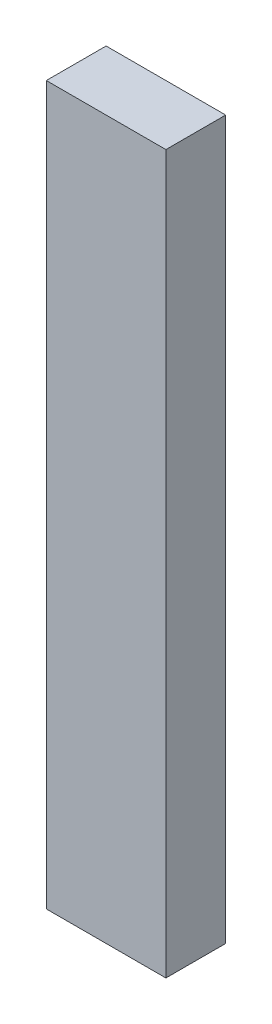
ISO-10303-21;
HEADER;
FILE_DESCRIPTION(('STEP AP214'),'2;1');
FILE_NAME('part.step','',(''),(''),'','','');
FILE_SCHEMA(('AUTOMOTIVE_DESIGN { 1 0 10303 214 1 1 1 1 }'));
ENDSEC;
DATA;
#1=APPLICATION_CONTEXT('core data for automotive mechanical design processes');
#2=APPLICATION_PROTOCOL_DEFINITION('international standard','automotive_design',2000,#1);
#3=PRODUCT_CONTEXT('',#1,'mechanical');
#4=PRODUCT('Part','Part','',(#3));
#5=PRODUCT_RELATED_PRODUCT_CATEGORY('part','',(#4));
#6=PRODUCT_DEFINITION_FORMATION('','',#4);
#7=PRODUCT_DEFINITION_CONTEXT('part definition',#1,'design');
#8=PRODUCT_DEFINITION('design','',#6,#7);
#9=PRODUCT_DEFINITION_SHAPE('','',#8);
#10=(LENGTH_UNIT() NAMED_UNIT(*) SI_UNIT(.MILLI.,.METRE.));
#11=(NAMED_UNIT(*) PLANE_ANGLE_UNIT() SI_UNIT($,.RADIAN.));
#12=(NAMED_UNIT(*) SI_UNIT($,.STERADIAN.) SOLID_ANGLE_UNIT());
#13=UNCERTAINTY_MEASURE_WITH_UNIT(LENGTH_MEASURE(1.E-05),#10,'distance_accuracy_value','');
#14=(GEOMETRIC_REPRESENTATION_CONTEXT(3) GLOBAL_UNCERTAINTY_ASSIGNED_CONTEXT((#13)) GLOBAL_UNIT_ASSIGNED_CONTEXT((#10,
#11,#12)) REPRESENTATION_CONTEXT('',''));
#15=CARTESIAN_POINT('',(0.,0.,0.));
#16=DIRECTION('',(0.,0.,1.));
#17=DIRECTION('',(1.,0.,0.));
#18=AXIS2_PLACEMENT_3D('',#15,#16,#17);
#19=CARTESIAN_POINT('',(0.,609.6,0.));
#20=DIRECTION('',(1.,0.,0.));
#21=DIRECTION('',(0.,0.,-1.));
#22=AXIS2_PLACEMENT_3D('',#19,#20,#21);
#23=PLANE('',#22);
#24=DIRECTION('',(0.,0.,1.));
#25=VECTOR('',#24,1.);
#26=CARTESIAN_POINT('',(0.,0.,0.));
#27=LINE('',#26,#25);
#28=CARTESIAN_POINT('',(0.,0.,0.));
#29=VERTEX_POINT('',#28);
#30=CARTESIAN_POINT('',(0.,0.,50.8));
#31=VERTEX_POINT('',#30);
#32=EDGE_CURVE('E107',#29,#31,#27,.T.);
#33=ORIENTED_EDGE('',*,*,#32,.T.);
#34=DIRECTION('',(0.,-1.,0.));
#35=VECTOR('',#34,1.);
#36=CARTESIAN_POINT('',(0.,609.6,50.8));
#37=LINE('',#36,#35);
#38=CARTESIAN_POINT('',(0.,609.6,50.8));
#39=VERTEX_POINT('',#38);
#40=EDGE_CURVE('E11',#39,#31,#37,.T.);
#41=ORIENTED_EDGE('',*,*,#40,.F.);
#42=DIRECTION('',(0.,0.,1.));
#43=VECTOR('',#42,1.);
#44=CARTESIAN_POINT('',(0.,609.6,0.));
#45=LINE('',#44,#43);
#46=CARTESIAN_POINT('',(0.,609.6,0.));
#47=VERTEX_POINT('',#46);
#48=EDGE_CURVE('E91',#47,#39,#45,.T.);
#49=ORIENTED_EDGE('',*,*,#48,.F.);
#50=DIRECTION('',(0.,-1.,0.));
#51=VECTOR('',#50,1.);
#52=CARTESIAN_POINT('',(0.,609.6,0.));
#53=LINE('',#52,#51);
#54=EDGE_CURVE('E103',#47,#29,#53,.T.);
#55=ORIENTED_EDGE('',*,*,#54,.T.);
#56=EDGE_LOOP('',(#33,#41,#49,#55));
#57=FACE_BOUND('',#56,.T.);
#58=ADVANCED_FACE('F39',(#57),#23,.F.);
#59=CARTESIAN_POINT('',(0.,609.6,50.8));
#60=DIRECTION('',(0.,0.,-1.));
#61=DIRECTION('',(-1.,0.,0.));
#62=AXIS2_PLACEMENT_3D('',#59,#60,#61);
#63=PLANE('',#62);
#64=DIRECTION('',(1.,0.,0.));
#65=VECTOR('',#64,1.);
#66=CARTESIAN_POINT('',(0.,0.,50.8));
#67=LINE('',#66,#65);
#68=CARTESIAN_POINT('',(101.6,0.,50.8));
#69=VERTEX_POINT('',#68);
#70=EDGE_CURVE('E96',#31,#69,#67,.T.);
#71=ORIENTED_EDGE('',*,*,#70,.T.);
#72=DIRECTION('',(0.,-1.,0.));
#73=VECTOR('',#72,1.);
#74=CARTESIAN_POINT('',(101.6,609.6,50.8));
#75=LINE('',#74,#73);
#76=CARTESIAN_POINT('',(101.6,609.6,50.8));
#77=VERTEX_POINT('',#76);
#78=EDGE_CURVE('E48',#77,#69,#75,.T.);
#79=ORIENTED_EDGE('',*,*,#78,.F.);
#80=DIRECTION('',(1.,0.,0.));
#81=VECTOR('',#80,1.);
#82=CARTESIAN_POINT('',(0.,609.6,50.8));
#83=LINE('',#82,#81);
#84=EDGE_CURVE('E86',#39,#77,#83,.T.);
#85=ORIENTED_EDGE('',*,*,#84,.F.);
#86=ORIENTED_EDGE('',*,*,#40,.T.);
#87=EDGE_LOOP('',(#71,#79,#85,#86));
#88=FACE_BOUND('',#87,.T.);
#89=ADVANCED_FACE('F95',(#88),#63,.F.);
#90=CARTESIAN_POINT('',(101.6,609.6,0.));
#91=DIRECTION('',(-1.,0.,0.));
#92=DIRECTION('',(0.,0.,1.));
#93=AXIS2_PLACEMENT_3D('',#90,#91,#92);
#94=PLANE('',#93);
#95=DIRECTION('',(0.,0.,-1.));
#96=VECTOR('',#95,1.);
#97=CARTESIAN_POINT('',(101.6,0.,0.));
#98=LINE('',#97,#96);
#99=CARTESIAN_POINT('',(101.6,0.,0.));
#100=VERTEX_POINT('',#99);
#101=EDGE_CURVE('E73',#69,#100,#98,.T.);
#102=ORIENTED_EDGE('',*,*,#101,.T.);
#103=DIRECTION('',(0.,-1.,0.));
#104=VECTOR('',#103,1.);
#105=CARTESIAN_POINT('',(101.6,609.6,0.));
#106=LINE('',#105,#104);
#107=CARTESIAN_POINT('',(101.6,609.6,0.));
#108=VERTEX_POINT('',#107);
#109=EDGE_CURVE('E98',#108,#100,#106,.T.);
#110=ORIENTED_EDGE('',*,*,#109,.F.);
#111=DIRECTION('',(0.,0.,-1.));
#112=VECTOR('',#111,1.);
#113=CARTESIAN_POINT('',(101.6,609.6,0.));
#114=LINE('',#113,#112);
#115=EDGE_CURVE('E89',#77,#108,#114,.T.);
#116=ORIENTED_EDGE('',*,*,#115,.F.);
#117=ORIENTED_EDGE('',*,*,#78,.T.);
#118=EDGE_LOOP('',(#102,#110,#116,#117));
#119=FACE_BOUND('',#118,.T.);
#120=ADVANCED_FACE('F99',(#119),#94,.F.);
#121=CARTESIAN_POINT('',(0.,609.6,0.));
#122=DIRECTION('',(0.,0.,1.));
#123=DIRECTION('',(1.,0.,0.));
#124=AXIS2_PLACEMENT_3D('',#121,#122,#123);
#125=PLANE('',#124);
#126=DIRECTION('',(-1.,0.,0.));
#127=VECTOR('',#126,1.);
#128=CARTESIAN_POINT('',(0.,0.,0.));
#129=LINE('',#128,#127);
#130=EDGE_CURVE('E79',#100,#29,#129,.T.);
#131=ORIENTED_EDGE('',*,*,#130,.T.);
#132=ORIENTED_EDGE('',*,*,#54,.F.);
#133=DIRECTION('',(-1.,0.,0.));
#134=VECTOR('',#133,1.);
#135=CARTESIAN_POINT('',(0.,609.6,0.));
#136=LINE('',#135,#134);
#137=EDGE_CURVE('E56',#108,#47,#136,.T.);
#138=ORIENTED_EDGE('',*,*,#137,.F.);
#139=ORIENTED_EDGE('',*,*,#109,.T.);
#140=EDGE_LOOP('',(#131,#132,#138,#139));
#141=FACE_BOUND('',#140,.T.);
#142=ADVANCED_FACE('F120',(#141),#125,.F.);
#143=CARTESIAN_POINT('',(0.,609.6,0.));
#144=DIRECTION('',(0.,1.,0.));
#145=DIRECTION('',(0.,0.,1.));
#146=AXIS2_PLACEMENT_3D('',#143,#144,#145);
#147=PLANE('',#146);
#148=ORIENTED_EDGE('',*,*,#48,.T.);
#149=ORIENTED_EDGE('',*,*,#84,.T.);
#150=ORIENTED_EDGE('',*,*,#115,.T.);
#151=ORIENTED_EDGE('',*,*,#137,.T.);
#152=EDGE_LOOP('',(#148,#149,#150,#151));
#153=FACE_BOUND('',#152,.T.);
#154=ADVANCED_FACE('F87',(#153),#147,.T.);
#155=CARTESIAN_POINT('',(0.,0.,0.));
#156=DIRECTION('',(0.,1.,0.));
#157=DIRECTION('',(0.,0.,1.));
#158=AXIS2_PLACEMENT_3D('',#155,#156,#157);
#159=PLANE('',#158);
#160=ORIENTED_EDGE('',*,*,#32,.F.);
#161=ORIENTED_EDGE('',*,*,#130,.F.);
#162=ORIENTED_EDGE('',*,*,#101,.F.);
#163=ORIENTED_EDGE('',*,*,#70,.F.);
#164=EDGE_LOOP('',(#160,#161,#162,#163));
#165=FACE_BOUND('',#164,.T.);
#166=ADVANCED_FACE('F123',(#165),#159,.F.);
#167=CLOSED_SHELL('',(#58,#89,#120,#142,#154,#166));
#168=MANIFOLD_SOLID_BREP('B2',#167);
#169=ADVANCED_BREP_SHAPE_REPRESENTATION('',(#18,#168),#14);
#170=SHAPE_DEFINITION_REPRESENTATION(#9,#169);
ENDSEC;
END-ISO-10303-21;
